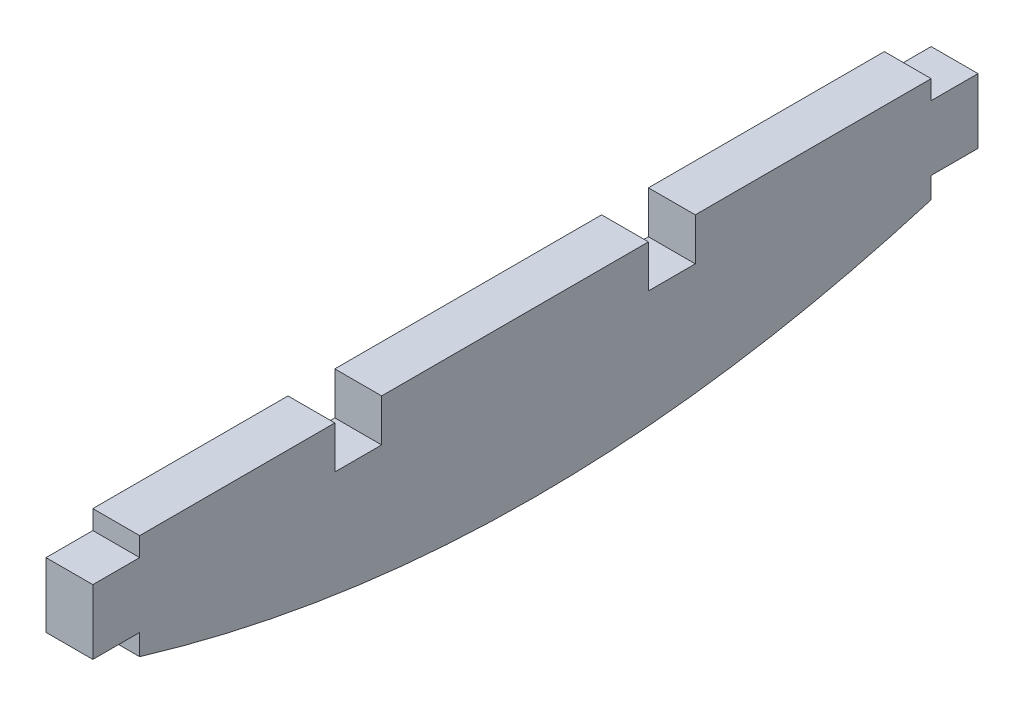
ISO-10303-21;
HEADER;
FILE_DESCRIPTION(('STEP AP214'),'2;1');
FILE_NAME('part.step','',(''),(''),'','','');
FILE_SCHEMA(('AUTOMOTIVE_DESIGN { 1 0 10303 214 1 1 1 1 }'));
ENDSEC;
DATA;
#1=APPLICATION_CONTEXT('core data for automotive mechanical design processes');
#2=APPLICATION_PROTOCOL_DEFINITION('international standard','automotive_design',2000,#1);
#3=PRODUCT_CONTEXT('',#1,'mechanical');
#4=PRODUCT('Part','Part','',(#3));
#5=PRODUCT_RELATED_PRODUCT_CATEGORY('part','',(#4));
#6=PRODUCT_DEFINITION_FORMATION('','',#4);
#7=PRODUCT_DEFINITION_CONTEXT('part definition',#1,'design');
#8=PRODUCT_DEFINITION('design','',#6,#7);
#9=PRODUCT_DEFINITION_SHAPE('','',#8);
#10=(LENGTH_UNIT() NAMED_UNIT(*) SI_UNIT(.MILLI.,.METRE.));
#11=(NAMED_UNIT(*) PLANE_ANGLE_UNIT() SI_UNIT($,.RADIAN.));
#12=(NAMED_UNIT(*) SI_UNIT($,.STERADIAN.) SOLID_ANGLE_UNIT());
#13=UNCERTAINTY_MEASURE_WITH_UNIT(LENGTH_MEASURE(1.E-05),#10,'distance_accuracy_value','');
#14=(GEOMETRIC_REPRESENTATION_CONTEXT(3) GLOBAL_UNCERTAINTY_ASSIGNED_CONTEXT((#13)) GLOBAL_UNIT_ASSIGNED_CONTEXT((#10,
#11,#12)) REPRESENTATION_CONTEXT('',''));
#15=CARTESIAN_POINT('',(0.,0.,0.));
#16=DIRECTION('',(0.,0.,1.));
#17=DIRECTION('',(1.,0.,0.));
#18=AXIS2_PLACEMENT_3D('',#15,#16,#17);
#19=CARTESIAN_POINT('',(3.,3.295,15.8480785445647));
#20=DIRECTION('',(0.,1.,0.));
#21=DIRECTION('',(0.,0.,1.));
#22=AXIS2_PLACEMENT_3D('',#19,#20,#21);
#23=PLANE('',#22);
#24=DIRECTION('',(0.,0.,-1.));
#25=VECTOR('',#24,1.);
#26=CARTESIAN_POINT('',(3.,3.295,15.8480785445647));
#27=LINE('',#26,#25);
#28=CARTESIAN_POINT('',(3.,3.295,15.8480785445647));
#29=VERTEX_POINT('',#28);
#30=CARTESIAN_POINT('',(3.,3.295,3.34807854456471));
#31=VERTEX_POINT('',#30);
#32=EDGE_CURVE('E311',#29,#31,#27,.T.);
#33=ORIENTED_EDGE('',*,*,#32,.T.);
#34=DIRECTION('',(-1.,0.,0.));
#35=VECTOR('',#34,1.);
#36=CARTESIAN_POINT('',(3.,3.295,3.34807854456471));
#37=LINE('',#36,#35);
#38=CARTESIAN_POINT('',(0.,3.295,3.34807854456471));
#39=VERTEX_POINT('',#38);
#40=EDGE_CURVE('E226',#31,#39,#37,.T.);
#41=ORIENTED_EDGE('',*,*,#40,.T.);
#42=DIRECTION('',(0.,0.,-1.));
#43=VECTOR('',#42,1.);
#44=CARTESIAN_POINT('',(0.,3.295,15.8480785445647));
#45=LINE('',#44,#43);
#46=CARTESIAN_POINT('',(0.,3.295,15.8480785445647));
#47=VERTEX_POINT('',#46);
#48=EDGE_CURVE('E329',#47,#39,#45,.T.);
#49=ORIENTED_EDGE('',*,*,#48,.F.);
#50=DIRECTION('',(-1.,0.,0.));
#51=VECTOR('',#50,1.);
#52=CARTESIAN_POINT('',(3.,3.295,15.8480785445647));
#53=LINE('',#52,#51);
#54=EDGE_CURVE('E338',#29,#47,#53,.T.);
#55=ORIENTED_EDGE('',*,*,#54,.F.);
#56=EDGE_LOOP('',(#33,#41,#49,#55));
#57=FACE_BOUND('',#56,.T.);
#58=ADVANCED_FACE('F37',(#57),#23,.T.);
#59=DIRECTION('',(-1.,0.,0.));
#60=VECTOR('',#59,1.);
#61=CARTESIAN_POINT('',(3.,3.295,0.348078544564714));
#62=LINE('',#61,#60);
#63=CARTESIAN_POINT('',(3.,3.295,0.348078544564714));
#64=VERTEX_POINT('',#63);
#65=CARTESIAN_POINT('',(0.,3.295,0.348078544564714));
#66=VERTEX_POINT('',#65);
#67=EDGE_CURVE('E185',#64,#66,#62,.T.);
#68=ORIENTED_EDGE('',*,*,#67,.F.);
#69=CARTESIAN_POINT('',(3.,3.295,-16.7419214554353));
#70=VERTEX_POINT('',#69);
#71=EDGE_CURVE('E307',#64,#70,#27,.T.);
#72=ORIENTED_EDGE('',*,*,#71,.T.);
#73=DIRECTION('',(-1.,0.,0.));
#74=VECTOR('',#73,1.);
#75=CARTESIAN_POINT('',(3.,3.295,-16.7419214554353));
#76=LINE('',#75,#74);
#77=CARTESIAN_POINT('',(0.,3.295,-16.7419214554353));
#78=VERTEX_POINT('',#77);
#79=EDGE_CURVE('E178',#70,#78,#76,.T.);
#80=ORIENTED_EDGE('',*,*,#79,.T.);
#81=EDGE_CURVE('E308',#66,#78,#45,.T.);
#82=ORIENTED_EDGE('',*,*,#81,.F.);
#83=EDGE_LOOP('',(#68,#72,#80,#82));
#84=FACE_BOUND('',#83,.T.);
#85=ADVANCED_FACE('F290',(#84),#23,.T.);
#86=CARTESIAN_POINT('',(3.,3.295,15.8480785445647));
#87=DIRECTION('',(0.,0.,-1.));
#88=DIRECTION('',(-1.,0.,0.));
#89=AXIS2_PLACEMENT_3D('',#86,#87,#88);
#90=PLANE('',#89);
#91=DIRECTION('',(-1.,0.,0.));
#92=VECTOR('',#91,1.);
#93=CARTESIAN_POINT('',(3.,2.075,15.8480785445647));
#94=LINE('',#93,#92);
#95=CARTESIAN_POINT('',(3.,2.075,15.8480785445647));
#96=VERTEX_POINT('',#95);
#97=CARTESIAN_POINT('',(0.,2.075,15.8480785445647));
#98=VERTEX_POINT('',#97);
#99=EDGE_CURVE('E378',#96,#98,#94,.T.);
#100=ORIENTED_EDGE('',*,*,#99,.F.);
#101=DIRECTION('',(0.,-1.,0.));
#102=VECTOR('',#101,1.);
#103=CARTESIAN_POINT('',(3.,3.295,15.8480785445647));
#104=LINE('',#103,#102);
#105=EDGE_CURVE('E320',#29,#96,#104,.T.);
#106=ORIENTED_EDGE('',*,*,#105,.F.);
#107=ORIENTED_EDGE('',*,*,#54,.T.);
#108=DIRECTION('',(0.,-1.,0.));
#109=VECTOR('',#108,1.);
#110=CARTESIAN_POINT('',(0.,3.295,15.8480785445647));
#111=LINE('',#110,#109);
#112=EDGE_CURVE('E332',#47,#98,#111,.T.);
#113=ORIENTED_EDGE('',*,*,#112,.T.);
#114=EDGE_LOOP('',(#100,#106,#107,#113));
#115=FACE_BOUND('',#114,.T.);
#116=ADVANCED_FACE('F287',(#115),#90,.F.);
#117=CARTESIAN_POINT('',(3.,3.295,-34.8519214554353));
#118=DIRECTION('',(0.,0.,-1.));
#119=DIRECTION('',(-1.,0.,0.));
#120=AXIS2_PLACEMENT_3D('',#117,#118,#119);
#121=PLANE('',#120);
#122=DIRECTION('',(0.,-1.,0.));
#123=VECTOR('',#122,1.);
#124=CARTESIAN_POINT('',(3.,3.295,-34.8519214554353));
#125=LINE('',#124,#123);
#126=CARTESIAN_POINT('',(3.,3.295,-34.8519214554353));
#127=VERTEX_POINT('',#126);
#128=CARTESIAN_POINT('',(3.,2.075,-34.8519214554353));
#129=VERTEX_POINT('',#128);
#130=EDGE_CURVE('E316',#127,#129,#125,.T.);
#131=ORIENTED_EDGE('',*,*,#130,.T.);
#132=DIRECTION('',(-1.,0.,0.));
#133=VECTOR('',#132,1.);
#134=CARTESIAN_POINT('',(3.,2.075,-34.8519214554353));
#135=LINE('',#134,#133);
#136=CARTESIAN_POINT('',(0.,2.075,-34.8519214554353));
#137=VERTEX_POINT('',#136);
#138=EDGE_CURVE('E348',#129,#137,#135,.T.);
#139=ORIENTED_EDGE('',*,*,#138,.T.);
#140=DIRECTION('',(0.,-1.,0.));
#141=VECTOR('',#140,1.);
#142=CARTESIAN_POINT('',(0.,3.295,-34.8519214554353));
#143=LINE('',#142,#141);
#144=CARTESIAN_POINT('',(0.,3.295,-34.8519214554353));
#145=VERTEX_POINT('',#144);
#146=EDGE_CURVE('E324',#145,#137,#143,.T.);
#147=ORIENTED_EDGE('',*,*,#146,.F.);
#148=DIRECTION('',(-1.,0.,0.));
#149=VECTOR('',#148,1.);
#150=CARTESIAN_POINT('',(3.,3.295,-34.8519214554353));
#151=LINE('',#150,#149);
#152=EDGE_CURVE('E45',#127,#145,#151,.T.);
#153=ORIENTED_EDGE('',*,*,#152,.F.);
#154=EDGE_LOOP('',(#131,#139,#147,#153));
#155=FACE_BOUND('',#154,.T.);
#156=ADVANCED_FACE('F294',(#155),#121,.T.);
#157=DIRECTION('',(-1.,0.,0.));
#158=VECTOR('',#157,1.);
#159=CARTESIAN_POINT('',(3.,-2.075,-34.8519214554353));
#160=LINE('',#159,#158);
#161=CARTESIAN_POINT('',(3.,-2.075,-34.8519214554353));
#162=VERTEX_POINT('',#161);
#163=CARTESIAN_POINT('',(0.,-2.075,-34.8519214554353));
#164=VERTEX_POINT('',#163);
#165=EDGE_CURVE('E415',#162,#164,#160,.T.);
#166=ORIENTED_EDGE('',*,*,#165,.F.);
#167=CARTESIAN_POINT('',(3.,-3.425,-34.8519214554353));
#168=VERTEX_POINT('',#167);
#169=EDGE_CURVE('E335',#162,#168,#125,.T.);
#170=ORIENTED_EDGE('',*,*,#169,.T.);
#171=DIRECTION('',(-1.,0.,0.));
#172=VECTOR('',#171,1.);
#173=CARTESIAN_POINT('',(3.,-3.425,-34.8519214554353));
#174=LINE('',#173,#172);
#175=CARTESIAN_POINT('',(0.,-3.425,-34.8519214554353));
#176=VERTEX_POINT('',#175);
#177=EDGE_CURVE('E11',#168,#176,#174,.T.);
#178=ORIENTED_EDGE('',*,*,#177,.T.);
#179=EDGE_CURVE('E328',#164,#176,#143,.T.);
#180=ORIENTED_EDGE('',*,*,#179,.F.);
#181=EDGE_LOOP('',(#166,#170,#178,#180));
#182=FACE_BOUND('',#181,.T.);
#183=ADVANCED_FACE('F39',(#182),#121,.T.);
#184=DIRECTION('',(-1.,0.,0.));
#185=VECTOR('',#184,1.);
#186=CARTESIAN_POINT('',(3.,3.295,-19.7419214554353));
#187=LINE('',#186,#185);
#188=CARTESIAN_POINT('',(3.,3.295,-19.7419214554353));
#189=VERTEX_POINT('',#188);
#190=CARTESIAN_POINT('',(0.,3.295,-19.7419214554353));
#191=VERTEX_POINT('',#190);
#192=EDGE_CURVE('E224',#189,#191,#187,.T.);
#193=ORIENTED_EDGE('',*,*,#192,.F.);
#194=EDGE_CURVE('E312',#189,#127,#27,.T.);
#195=ORIENTED_EDGE('',*,*,#194,.T.);
#196=ORIENTED_EDGE('',*,*,#152,.T.);
#197=EDGE_CURVE('E327',#191,#145,#45,.T.);
#198=ORIENTED_EDGE('',*,*,#197,.F.);
#199=EDGE_LOOP('',(#193,#195,#196,#198));
#200=FACE_BOUND('',#199,.T.);
#201=ADVANCED_FACE('F285',(#200),#23,.T.);
#202=CARTESIAN_POINT('',(3.,-2.075,15.8480785445647));
#203=VERTEX_POINT('',#202);
#204=CARTESIAN_POINT('',(3.,-3.425,15.8480785445647));
#205=VERTEX_POINT('',#204);
#206=EDGE_CURVE('E315',#203,#205,#104,.T.);
#207=ORIENTED_EDGE('',*,*,#206,.F.);
#208=DIRECTION('',(-1.,0.,0.));
#209=VECTOR('',#208,1.);
#210=CARTESIAN_POINT('',(3.,-2.075,15.8480785445647));
#211=LINE('',#210,#209);
#212=CARTESIAN_POINT('',(0.,-2.075,15.8480785445647));
#213=VERTEX_POINT('',#212);
#214=EDGE_CURVE('E392',#203,#213,#211,.T.);
#215=ORIENTED_EDGE('',*,*,#214,.T.);
#216=CARTESIAN_POINT('',(0.,-3.425,15.8480785445647));
#217=VERTEX_POINT('',#216);
#218=EDGE_CURVE('E331',#213,#217,#111,.T.);
#219=ORIENTED_EDGE('',*,*,#218,.T.);
#220=DIRECTION('',(-1.,0.,0.));
#221=VECTOR('',#220,1.);
#222=CARTESIAN_POINT('',(3.,-3.425,15.8480785445647));
#223=LINE('',#222,#221);
#224=EDGE_CURVE('E323',#205,#217,#223,.T.);
#225=ORIENTED_EDGE('',*,*,#224,.F.);
#226=EDGE_LOOP('',(#207,#215,#219,#225));
#227=FACE_BOUND('',#226,.T.);
#228=ADVANCED_FACE('F280',(#227),#90,.F.);
#229=CARTESIAN_POINT('',(3.,0.,0.));
#230=DIRECTION('',(-1.,0.,0.));
#231=DIRECTION('',(0.,0.,1.));
#232=AXIS2_PLACEMENT_3D('',#229,#230,#231);
#233=PLANE('',#232);
#234=ORIENTED_EDGE('',*,*,#71,.F.);
#235=DIRECTION('',(0.,1.,0.));
#236=VECTOR('',#235,1.);
#237=CARTESIAN_POINT('',(3.,0.575,0.348078544564714));
#238=LINE('',#237,#236);
#239=CARTESIAN_POINT('',(3.,0.575,0.348078544564714));
#240=VERTEX_POINT('',#239);
#241=EDGE_CURVE('E198',#240,#64,#238,.T.);
#242=ORIENTED_EDGE('',*,*,#241,.F.);
#243=DIRECTION('',(0.,0.,-1.));
#244=VECTOR('',#243,1.);
#245=CARTESIAN_POINT('',(3.,0.575,3.34807854456471));
#246=LINE('',#245,#244);
#247=CARTESIAN_POINT('',(3.,0.575,3.34807854456471));
#248=VERTEX_POINT('',#247);
#249=EDGE_CURVE('E175',#248,#240,#246,.T.);
#250=ORIENTED_EDGE('',*,*,#249,.F.);
#251=DIRECTION('',(0.,1.,0.));
#252=VECTOR('',#251,1.);
#253=CARTESIAN_POINT('',(3.,0.575,3.34807854456471));
#254=LINE('',#253,#252);
#255=EDGE_CURVE('E189',#248,#31,#254,.T.);
#256=ORIENTED_EDGE('',*,*,#255,.T.);
#257=ORIENTED_EDGE('',*,*,#32,.F.);
#258=ORIENTED_EDGE('',*,*,#105,.T.);
#259=DIRECTION('',(0.,0.,-1.));
#260=VECTOR('',#259,1.);
#261=CARTESIAN_POINT('',(3.,2.075,0.));
#262=LINE('',#261,#260);
#263=CARTESIAN_POINT('',(3.,2.075,18.8480785445647));
#264=VERTEX_POINT('',#263);
#265=EDGE_CURVE('E381',#264,#96,#262,.T.);
#266=ORIENTED_EDGE('',*,*,#265,.F.);
#267=DIRECTION('',(0.,1.,0.));
#268=VECTOR('',#267,1.);
#269=CARTESIAN_POINT('',(3.,0.,18.8480785445647));
#270=LINE('',#269,#268);
#271=CARTESIAN_POINT('',(3.,-2.075,18.8480785445647));
#272=VERTEX_POINT('',#271);
#273=EDGE_CURVE('E383',#272,#264,#270,.T.);
#274=ORIENTED_EDGE('',*,*,#273,.F.);
#275=DIRECTION('',(0.,0.,-1.));
#276=VECTOR('',#275,1.);
#277=CARTESIAN_POINT('',(3.,-2.075,0.));
#278=LINE('',#277,#276);
#279=EDGE_CURVE('E390',#272,#203,#278,.T.);
#280=ORIENTED_EDGE('',*,*,#279,.T.);
#281=ORIENTED_EDGE('',*,*,#206,.T.);
#282=CARTESIAN_POINT('',(3.,-3.425,-34.8519214554353));
#283=CARTESIAN_POINT('',(3.,-11.0260618009956,-9.50192145543528));
#284=CARTESIAN_POINT('',(3.,-3.425,15.8480785445647));
#285=B_SPLINE_CURVE_WITH_KNOTS('',2,(#282,#283,#284),.UNSPECIFIED.,.F.,.F.,(3,3),(0.,1.),.UNSPECIFIED.);
#286=EDGE_CURVE('E231',#168,#205,#285,.T.);
#287=ORIENTED_EDGE('',*,*,#286,.F.);
#288=ORIENTED_EDGE('',*,*,#169,.F.);
#289=DIRECTION('',(0.,0.,-1.));
#290=VECTOR('',#289,1.);
#291=CARTESIAN_POINT('',(3.,-2.075,0.));
#292=LINE('',#291,#290);
#293=CARTESIAN_POINT('',(3.,-2.075,-37.8519214554353));
#294=VERTEX_POINT('',#293);
#295=EDGE_CURVE('E407',#162,#294,#292,.T.);
#296=ORIENTED_EDGE('',*,*,#295,.T.);
#297=DIRECTION('',(0.,1.,0.));
#298=VECTOR('',#297,1.);
#299=CARTESIAN_POINT('',(3.,0.,-37.8519214554353));
#300=LINE('',#299,#298);
#301=CARTESIAN_POINT('',(3.,2.075,-37.8519214554353));
#302=VERTEX_POINT('',#301);
#303=EDGE_CURVE('E410',#294,#302,#300,.T.);
#304=ORIENTED_EDGE('',*,*,#303,.T.);
#305=DIRECTION('',(0.,0.,-1.));
#306=VECTOR('',#305,1.);
#307=CARTESIAN_POINT('',(3.,2.075,0.));
#308=LINE('',#307,#306);
#309=EDGE_CURVE('E412',#129,#302,#308,.T.);
#310=ORIENTED_EDGE('',*,*,#309,.F.);
#311=ORIENTED_EDGE('',*,*,#130,.F.);
#312=ORIENTED_EDGE('',*,*,#194,.F.);
#313=DIRECTION('',(0.,1.,0.));
#314=VECTOR('',#313,1.);
#315=CARTESIAN_POINT('',(3.,0.575,-19.7419214554353));
#316=LINE('',#315,#314);
#317=CARTESIAN_POINT('',(3.,0.575,-19.7419214554353));
#318=VERTEX_POINT('',#317);
#319=EDGE_CURVE('E200',#318,#189,#316,.T.);
#320=ORIENTED_EDGE('',*,*,#319,.F.);
#321=DIRECTION('',(0.,0.,-1.));
#322=VECTOR('',#321,1.);
#323=CARTESIAN_POINT('',(3.,0.575,-16.7419214554353));
#324=LINE('',#323,#322);
#325=CARTESIAN_POINT('',(3.,0.575,-16.7419214554353));
#326=VERTEX_POINT('',#325);
#327=EDGE_CURVE('E213',#326,#318,#324,.T.);
#328=ORIENTED_EDGE('',*,*,#327,.F.);
#329=DIRECTION('',(0.,1.,0.));
#330=VECTOR('',#329,1.);
#331=CARTESIAN_POINT('',(3.,0.575,-16.7419214554353));
#332=LINE('',#331,#330);
#333=EDGE_CURVE('E210',#326,#70,#332,.T.);
#334=ORIENTED_EDGE('',*,*,#333,.T.);
#335=EDGE_LOOP('',(#234,#242,#250,#256,#257,#258,#266,#274,#280,#281,#287,#288,#296,#304,#310,
#311,#312,#320,#328,#334));
#336=FACE_BOUND('',#335,.T.);
#337=ADVANCED_FACE('F277',(#336),#233,.F.);
#338=CARTESIAN_POINT('',(0.,0.,0.));
#339=DIRECTION('',(-1.,0.,0.));
#340=DIRECTION('',(0.,0.,1.));
#341=AXIS2_PLACEMENT_3D('',#338,#339,#340);
#342=PLANE('',#341);
#343=DIRECTION('',(0.,1.,0.));
#344=VECTOR('',#343,1.);
#345=CARTESIAN_POINT('',(0.,0.575,0.348078544564714));
#346=LINE('',#345,#344);
#347=CARTESIAN_POINT('',(0.,0.575,0.348078544564714));
#348=VERTEX_POINT('',#347);
#349=EDGE_CURVE('E182',#348,#66,#346,.T.);
#350=ORIENTED_EDGE('',*,*,#349,.T.);
#351=ORIENTED_EDGE('',*,*,#81,.T.);
#352=DIRECTION('',(0.,1.,0.));
#353=VECTOR('',#352,1.);
#354=CARTESIAN_POINT('',(0.,0.575,-16.7419214554353));
#355=LINE('',#354,#353);
#356=CARTESIAN_POINT('',(0.,0.575,-16.7419214554353));
#357=VERTEX_POINT('',#356);
#358=EDGE_CURVE('E209',#357,#78,#355,.T.);
#359=ORIENTED_EDGE('',*,*,#358,.F.);
#360=DIRECTION('',(0.,0.,-1.));
#361=VECTOR('',#360,1.);
#362=CARTESIAN_POINT('',(0.,0.575,-16.7419214554353));
#363=LINE('',#362,#361);
#364=CARTESIAN_POINT('',(0.,0.575,-19.7419214554353));
#365=VERTEX_POINT('',#364);
#366=EDGE_CURVE('E60',#357,#365,#363,.T.);
#367=ORIENTED_EDGE('',*,*,#366,.T.);
#368=DIRECTION('',(0.,1.,0.));
#369=VECTOR('',#368,1.);
#370=CARTESIAN_POINT('',(0.,0.575,-19.7419214554353));
#371=LINE('',#370,#369);
#372=EDGE_CURVE('E214',#365,#191,#371,.T.);
#373=ORIENTED_EDGE('',*,*,#372,.T.);
#374=ORIENTED_EDGE('',*,*,#197,.T.);
#375=ORIENTED_EDGE('',*,*,#146,.T.);
#376=DIRECTION('',(0.,0.,-1.));
#377=VECTOR('',#376,1.);
#378=CARTESIAN_POINT('',(0.,2.075,0.));
#379=LINE('',#378,#377);
#380=CARTESIAN_POINT('',(0.,2.075,-37.8519214554353));
#381=VERTEX_POINT('',#380);
#382=EDGE_CURVE('E350',#137,#381,#379,.T.);
#383=ORIENTED_EDGE('',*,*,#382,.T.);
#384=DIRECTION('',(0.,1.,0.));
#385=VECTOR('',#384,1.);
#386=CARTESIAN_POINT('',(0.,0.,-37.8519214554353));
#387=LINE('',#386,#385);
#388=CARTESIAN_POINT('',(0.,-2.075,-37.8519214554353));
#389=VERTEX_POINT('',#388);
#390=EDGE_CURVE('E418',#389,#381,#387,.T.);
#391=ORIENTED_EDGE('',*,*,#390,.F.);
#392=DIRECTION('',(0.,0.,-1.));
#393=VECTOR('',#392,1.);
#394=CARTESIAN_POINT('',(0.,-2.075,0.));
#395=LINE('',#394,#393);
#396=EDGE_CURVE('E406',#164,#389,#395,.T.);
#397=ORIENTED_EDGE('',*,*,#396,.F.);
#398=ORIENTED_EDGE('',*,*,#179,.T.);
#399=CARTESIAN_POINT('',(0.,-3.425,-34.8519214554353));
#400=CARTESIAN_POINT('',(0.,-11.0260618009956,-9.50192145543528));
#401=CARTESIAN_POINT('',(0.,-3.425,15.8480785445647));
#402=B_SPLINE_CURVE_WITH_KNOTS('',2,(#399,#400,#401),.UNSPECIFIED.,.F.,.F.,(3,3),(0.,1.),.UNSPECIFIED.);
#403=EDGE_CURVE('E230',#176,#217,#402,.T.);
#404=ORIENTED_EDGE('',*,*,#403,.T.);
#405=ORIENTED_EDGE('',*,*,#218,.F.);
#406=DIRECTION('',(0.,0.,-1.));
#407=VECTOR('',#406,1.);
#408=CARTESIAN_POINT('',(0.,-2.075,0.));
#409=LINE('',#408,#407);
#410=CARTESIAN_POINT('',(0.,-2.075,18.8480785445647));
#411=VERTEX_POINT('',#410);
#412=EDGE_CURVE('E384',#411,#213,#409,.T.);
#413=ORIENTED_EDGE('',*,*,#412,.F.);
#414=DIRECTION('',(0.,1.,0.));
#415=VECTOR('',#414,1.);
#416=CARTESIAN_POINT('',(0.,0.,18.8480785445647));
#417=LINE('',#416,#415);
#418=CARTESIAN_POINT('',(0.,2.075,18.8480785445647));
#419=VERTEX_POINT('',#418);
#420=EDGE_CURVE('E397',#411,#419,#417,.T.);
#421=ORIENTED_EDGE('',*,*,#420,.T.);
#422=DIRECTION('',(0.,0.,-1.));
#423=VECTOR('',#422,1.);
#424=CARTESIAN_POINT('',(0.,2.075,0.));
#425=LINE('',#424,#423);
#426=EDGE_CURVE('E237',#419,#98,#425,.T.);
#427=ORIENTED_EDGE('',*,*,#426,.T.);
#428=ORIENTED_EDGE('',*,*,#112,.F.);
#429=ORIENTED_EDGE('',*,*,#48,.T.);
#430=DIRECTION('',(0.,1.,0.));
#431=VECTOR('',#430,1.);
#432=CARTESIAN_POINT('',(0.,0.575,3.34807854456471));
#433=LINE('',#432,#431);
#434=CARTESIAN_POINT('',(0.,0.575,3.34807854456471));
#435=VERTEX_POINT('',#434);
#436=EDGE_CURVE('E194',#435,#39,#433,.T.);
#437=ORIENTED_EDGE('',*,*,#436,.F.);
#438=DIRECTION('',(0.,0.,-1.));
#439=VECTOR('',#438,1.);
#440=CARTESIAN_POINT('',(0.,0.575,3.34807854456471));
#441=LINE('',#440,#439);
#442=EDGE_CURVE('E52',#435,#348,#441,.T.);
#443=ORIENTED_EDGE('',*,*,#442,.T.);
#444=EDGE_LOOP('',(#350,#351,#359,#367,#373,#374,#375,#383,#391,#397,#398,#404,#405,#413,#421,
#427,#428,#429,#437,#443));
#445=FACE_BOUND('',#444,.T.);
#446=ADVANCED_FACE('F192',(#445),#342,.T.);
#447=CARTESIAN_POINT('',(3.,-2.075,0.));
#448=DIRECTION('',(0.,1.,0.));
#449=DIRECTION('',(0.,0.,1.));
#450=AXIS2_PLACEMENT_3D('',#447,#448,#449);
#451=PLANE('',#450);
#452=ORIENTED_EDGE('',*,*,#396,.T.);
#453=DIRECTION('',(-1.,0.,0.));
#454=VECTOR('',#453,1.);
#455=CARTESIAN_POINT('',(3.,-2.075,-37.8519214554353));
#456=LINE('',#455,#454);
#457=EDGE_CURVE('E425',#294,#389,#456,.T.);
#458=ORIENTED_EDGE('',*,*,#457,.F.);
#459=ORIENTED_EDGE('',*,*,#295,.F.);
#460=ORIENTED_EDGE('',*,*,#165,.T.);
#461=EDGE_LOOP('',(#452,#458,#459,#460));
#462=FACE_BOUND('',#461,.T.);
#463=ADVANCED_FACE('F272',(#462),#451,.F.);
#464=CARTESIAN_POINT('',(3.,0.,-37.8519214554353));
#465=DIRECTION('',(0.,0.,1.));
#466=DIRECTION('',(1.,0.,0.));
#467=AXIS2_PLACEMENT_3D('',#464,#465,#466);
#468=PLANE('',#467);
#469=ORIENTED_EDGE('',*,*,#390,.T.);
#470=DIRECTION('',(-1.,0.,0.));
#471=VECTOR('',#470,1.);
#472=CARTESIAN_POINT('',(3.,2.075,-37.8519214554353));
#473=LINE('',#472,#471);
#474=EDGE_CURVE('E424',#302,#381,#473,.T.);
#475=ORIENTED_EDGE('',*,*,#474,.F.);
#476=ORIENTED_EDGE('',*,*,#303,.F.);
#477=ORIENTED_EDGE('',*,*,#457,.T.);
#478=EDGE_LOOP('',(#469,#475,#476,#477));
#479=FACE_BOUND('',#478,.T.);
#480=ADVANCED_FACE('F268',(#479),#468,.F.);
#481=CARTESIAN_POINT('',(3.,2.075,0.));
#482=DIRECTION('',(0.,1.,0.));
#483=DIRECTION('',(0.,0.,1.));
#484=AXIS2_PLACEMENT_3D('',#481,#482,#483);
#485=PLANE('',#484);
#486=ORIENTED_EDGE('',*,*,#382,.F.);
#487=ORIENTED_EDGE('',*,*,#138,.F.);
#488=ORIENTED_EDGE('',*,*,#309,.T.);
#489=ORIENTED_EDGE('',*,*,#474,.T.);
#490=EDGE_LOOP('',(#486,#487,#488,#489));
#491=FACE_BOUND('',#490,.T.);
#492=ADVANCED_FACE('F264',(#491),#485,.T.);
#493=CARTESIAN_POINT('',(3.,2.075,0.));
#494=DIRECTION('',(0.,1.,0.));
#495=DIRECTION('',(0.,0.,1.));
#496=AXIS2_PLACEMENT_3D('',#493,#494,#495);
#497=PLANE('',#496);
#498=ORIENTED_EDGE('',*,*,#426,.F.);
#499=DIRECTION('',(-1.,0.,0.));
#500=VECTOR('',#499,1.);
#501=CARTESIAN_POINT('',(3.,2.075,18.8480785445647));
#502=LINE('',#501,#500);
#503=EDGE_CURVE('E386',#264,#419,#502,.T.);
#504=ORIENTED_EDGE('',*,*,#503,.F.);
#505=ORIENTED_EDGE('',*,*,#265,.T.);
#506=ORIENTED_EDGE('',*,*,#99,.T.);
#507=EDGE_LOOP('',(#498,#504,#505,#506));
#508=FACE_BOUND('',#507,.T.);
#509=ADVANCED_FACE('F260',(#508),#497,.T.);
#510=CARTESIAN_POINT('',(3.,0.,18.8480785445647));
#511=DIRECTION('',(0.,0.,1.));
#512=DIRECTION('',(1.,0.,0.));
#513=AXIS2_PLACEMENT_3D('',#510,#511,#512);
#514=PLANE('',#513);
#515=ORIENTED_EDGE('',*,*,#420,.F.);
#516=DIRECTION('',(-1.,0.,0.));
#517=VECTOR('',#516,1.);
#518=CARTESIAN_POINT('',(3.,-2.075,18.8480785445647));
#519=LINE('',#518,#517);
#520=EDGE_CURVE('E388',#272,#411,#519,.T.);
#521=ORIENTED_EDGE('',*,*,#520,.F.);
#522=ORIENTED_EDGE('',*,*,#273,.T.);
#523=ORIENTED_EDGE('',*,*,#503,.T.);
#524=EDGE_LOOP('',(#515,#521,#522,#523));
#525=FACE_BOUND('',#524,.T.);
#526=ADVANCED_FACE('F256',(#525),#514,.T.);
#527=CARTESIAN_POINT('',(3.,-2.075,0.));
#528=DIRECTION('',(0.,1.,0.));
#529=DIRECTION('',(0.,0.,1.));
#530=AXIS2_PLACEMENT_3D('',#527,#528,#529);
#531=PLANE('',#530);
#532=ORIENTED_EDGE('',*,*,#412,.T.);
#533=ORIENTED_EDGE('',*,*,#214,.F.);
#534=ORIENTED_EDGE('',*,*,#279,.F.);
#535=ORIENTED_EDGE('',*,*,#520,.T.);
#536=EDGE_LOOP('',(#532,#533,#534,#535));
#537=FACE_BOUND('',#536,.T.);
#538=ADVANCED_FACE('F250',(#537),#531,.F.);
#539=DIRECTION('',(-1.,0.,0.));
#540=VECTOR('',#539,1.);
#541=SURFACE_OF_LINEAR_EXTRUSION('',#285,#540);
#542=ORIENTED_EDGE('',*,*,#403,.F.);
#543=ORIENTED_EDGE('',*,*,#177,.F.);
#544=ORIENTED_EDGE('',*,*,#286,.T.);
#545=ORIENTED_EDGE('',*,*,#224,.T.);
#546=EDGE_LOOP('',(#542,#543,#544,#545));
#547=FACE_BOUND('',#546,.T.);
#548=ADVANCED_FACE('F245',(#547),#541,.T.);
#549=CARTESIAN_POINT('',(0.,0.575,-19.7419214554353));
#550=DIRECTION('',(0.,0.,-1.));
#551=DIRECTION('',(-1.,0.,0.));
#552=AXIS2_PLACEMENT_3D('',#549,#550,#551);
#553=PLANE('',#552);
#554=ORIENTED_EDGE('',*,*,#192,.T.);
#555=ORIENTED_EDGE('',*,*,#372,.F.);
#556=DIRECTION('',(1.,0.,0.));
#557=VECTOR('',#556,1.);
#558=CARTESIAN_POINT('',(0.,0.575,-19.7419214554353));
#559=LINE('',#558,#557);
#560=EDGE_CURVE('E205',#365,#318,#559,.T.);
#561=ORIENTED_EDGE('',*,*,#560,.T.);
#562=ORIENTED_EDGE('',*,*,#319,.T.);
#563=EDGE_LOOP('',(#554,#555,#561,#562));
#564=FACE_BOUND('',#563,.T.);
#565=ADVANCED_FACE('F249',(#564),#553,.F.);
#566=CARTESIAN_POINT('',(0.,0.575,-16.7419214554353));
#567=DIRECTION('',(0.,-1.,0.));
#568=DIRECTION('',(0.,0.,-1.));
#569=AXIS2_PLACEMENT_3D('',#566,#567,#568);
#570=PLANE('',#569);
#571=ORIENTED_EDGE('',*,*,#327,.T.);
#572=ORIENTED_EDGE('',*,*,#560,.F.);
#573=ORIENTED_EDGE('',*,*,#366,.F.);
#574=DIRECTION('',(1.,0.,0.));
#575=VECTOR('',#574,1.);
#576=CARTESIAN_POINT('',(0.,0.575,-16.7419214554353));
#577=LINE('',#576,#575);
#578=EDGE_CURVE('E207',#357,#326,#577,.T.);
#579=ORIENTED_EDGE('',*,*,#578,.T.);
#580=EDGE_LOOP('',(#571,#572,#573,#579));
#581=FACE_BOUND('',#580,.T.);
#582=ADVANCED_FACE('F354',(#581),#570,.F.);
#583=CARTESIAN_POINT('',(0.,0.575,-16.7419214554353));
#584=DIRECTION('',(0.,0.,-1.));
#585=DIRECTION('',(-1.,0.,0.));
#586=AXIS2_PLACEMENT_3D('',#583,#584,#585);
#587=PLANE('',#586);
#588=ORIENTED_EDGE('',*,*,#333,.F.);
#589=ORIENTED_EDGE('',*,*,#578,.F.);
#590=ORIENTED_EDGE('',*,*,#358,.T.);
#591=ORIENTED_EDGE('',*,*,#79,.F.);
#592=EDGE_LOOP('',(#588,#589,#590,#591));
#593=FACE_BOUND('',#592,.T.);
#594=ADVANCED_FACE('F252',(#593),#587,.T.);
#595=CARTESIAN_POINT('',(0.,0.575,0.348078544564714));
#596=DIRECTION('',(0.,0.,-1.));
#597=DIRECTION('',(-1.,0.,0.));
#598=AXIS2_PLACEMENT_3D('',#595,#596,#597);
#599=PLANE('',#598);
#600=ORIENTED_EDGE('',*,*,#67,.T.);
#601=ORIENTED_EDGE('',*,*,#349,.F.);
#602=DIRECTION('',(1.,0.,0.));
#603=VECTOR('',#602,1.);
#604=CARTESIAN_POINT('',(0.,0.575,0.348078544564714));
#605=LINE('',#604,#603);
#606=EDGE_CURVE('E171',#348,#240,#605,.T.);
#607=ORIENTED_EDGE('',*,*,#606,.T.);
#608=ORIENTED_EDGE('',*,*,#241,.T.);
#609=EDGE_LOOP('',(#600,#601,#607,#608));
#610=FACE_BOUND('',#609,.T.);
#611=ADVANCED_FACE('F183',(#610),#599,.F.);
#612=CARTESIAN_POINT('',(0.,0.575,3.34807854456471));
#613=DIRECTION('',(0.,-1.,0.));
#614=DIRECTION('',(0.,0.,-1.));
#615=AXIS2_PLACEMENT_3D('',#612,#613,#614);
#616=PLANE('',#615);
#617=ORIENTED_EDGE('',*,*,#249,.T.);
#618=ORIENTED_EDGE('',*,*,#606,.F.);
#619=ORIENTED_EDGE('',*,*,#442,.F.);
#620=DIRECTION('',(1.,0.,0.));
#621=VECTOR('',#620,1.);
#622=CARTESIAN_POINT('',(0.,0.575,3.34807854456471));
#623=LINE('',#622,#621);
#624=EDGE_CURVE('E179',#435,#248,#623,.T.);
#625=ORIENTED_EDGE('',*,*,#624,.T.);
#626=EDGE_LOOP('',(#617,#618,#619,#625));
#627=FACE_BOUND('',#626,.T.);
#628=ADVANCED_FACE('F173',(#627),#616,.F.);
#629=CARTESIAN_POINT('',(0.,0.575,3.34807854456471));
#630=DIRECTION('',(0.,0.,-1.));
#631=DIRECTION('',(-1.,0.,0.));
#632=AXIS2_PLACEMENT_3D('',#629,#630,#631);
#633=PLANE('',#632);
#634=ORIENTED_EDGE('',*,*,#255,.F.);
#635=ORIENTED_EDGE('',*,*,#624,.F.);
#636=ORIENTED_EDGE('',*,*,#436,.T.);
#637=ORIENTED_EDGE('',*,*,#40,.F.);
#638=EDGE_LOOP('',(#634,#635,#636,#637));
#639=FACE_BOUND('',#638,.T.);
#640=ADVANCED_FACE('F367',(#639),#633,.T.);
#641=CLOSED_SHELL('',(#58,#85,#116,#156,#183,#201,#228,#337,#446,#463,#480,#492,#509,#526,#538,
#548,#565,#582,#594,#611,#628,#640));
#642=MANIFOLD_SOLID_BREP('B2',#641);
#643=ADVANCED_BREP_SHAPE_REPRESENTATION('',(#18,#642),#14);
#644=SHAPE_DEFINITION_REPRESENTATION(#9,#643);
ENDSEC;
END-ISO-10303-21;
